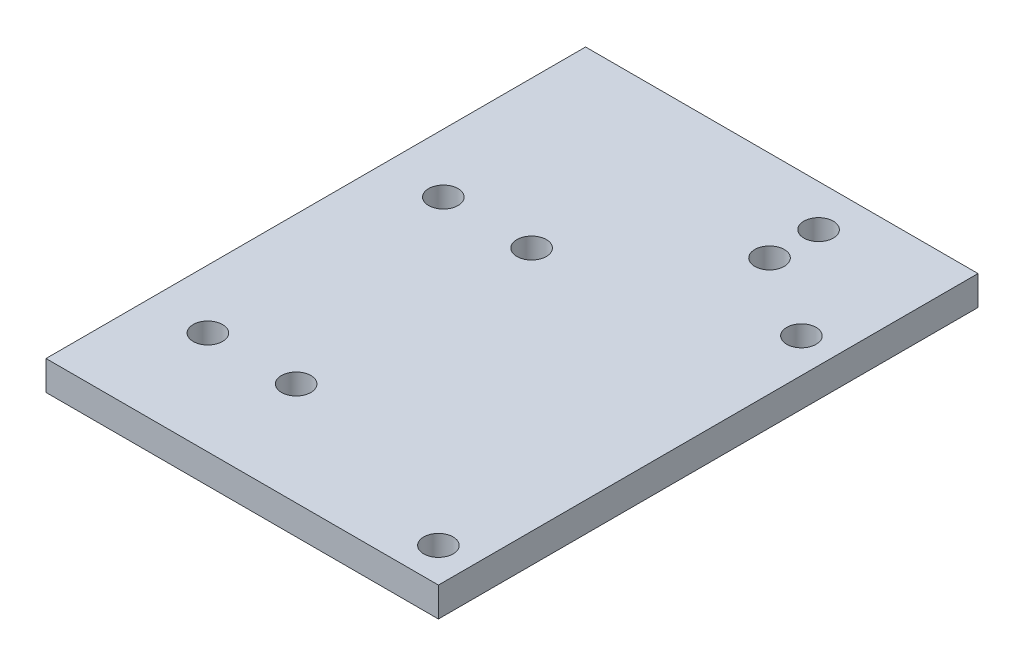
ISO-10303-21;
HEADER;
FILE_DESCRIPTION(('STEP AP214'),'2;1');
FILE_NAME('part.step','',(''),(''),'','','');
FILE_SCHEMA(('AUTOMOTIVE_DESIGN { 1 0 10303 214 1 1 1 1 }'));
ENDSEC;
DATA;
#1=APPLICATION_CONTEXT('core data for automotive mechanical design processes');
#2=APPLICATION_PROTOCOL_DEFINITION('international standard','automotive_design',2000,#1);
#3=PRODUCT_CONTEXT('',#1,'mechanical');
#4=PRODUCT('Part','Part','',(#3));
#5=PRODUCT_RELATED_PRODUCT_CATEGORY('part','',(#4));
#6=PRODUCT_DEFINITION_FORMATION('','',#4);
#7=PRODUCT_DEFINITION_CONTEXT('part definition',#1,'design');
#8=PRODUCT_DEFINITION('design','',#6,#7);
#9=PRODUCT_DEFINITION_SHAPE('','',#8);
#10=(LENGTH_UNIT() NAMED_UNIT(*) SI_UNIT(.MILLI.,.METRE.));
#11=(NAMED_UNIT(*) PLANE_ANGLE_UNIT() SI_UNIT($,.RADIAN.));
#12=(NAMED_UNIT(*) SI_UNIT($,.STERADIAN.) SOLID_ANGLE_UNIT());
#13=UNCERTAINTY_MEASURE_WITH_UNIT(LENGTH_MEASURE(1.E-05),#10,'distance_accuracy_value','');
#14=(GEOMETRIC_REPRESENTATION_CONTEXT(3) GLOBAL_UNCERTAINTY_ASSIGNED_CONTEXT((#13)) GLOBAL_UNIT_ASSIGNED_CONTEXT((#10,
#11,#12)) REPRESENTATION_CONTEXT('',''));
#15=CARTESIAN_POINT('',(0.,0.,0.));
#16=DIRECTION('',(0.,0.,1.));
#17=DIRECTION('',(1.,0.,0.));
#18=AXIS2_PLACEMENT_3D('',#15,#16,#17);
#19=CARTESIAN_POINT('',(1.85754189944134,3.,-30.2374301675978));
#20=DIRECTION('',(1.,0.,0.));
#21=DIRECTION('',(0.,0.,-1.));
#22=AXIS2_PLACEMENT_3D('',#19,#20,#21);
#23=PLANE('',#22);
#24=DIRECTION('',(0.,0.,1.));
#25=VECTOR('',#24,1.);
#26=CARTESIAN_POINT('',(1.85754189944134,0.,-30.2374301675978));
#27=LINE('',#26,#25);
#28=CARTESIAN_POINT('',(1.85754189944134,0.,-30.2374301675978));
#29=VERTEX_POINT('',#28);
#30=CARTESIAN_POINT('',(1.85754189944135,0.,24.7625698324022));
#31=VERTEX_POINT('',#30);
#32=EDGE_CURVE('E98',#29,#31,#27,.T.);
#33=ORIENTED_EDGE('',*,*,#32,.T.);
#34=DIRECTION('',(0.,-1.,0.));
#35=VECTOR('',#34,1.);
#36=CARTESIAN_POINT('',(1.85754189944135,3.,24.7625698324022));
#37=LINE('',#36,#35);
#38=CARTESIAN_POINT('',(1.85754189944135,3.,24.7625698324022));
#39=VERTEX_POINT('',#38);
#40=EDGE_CURVE('E11',#39,#31,#37,.T.);
#41=ORIENTED_EDGE('',*,*,#40,.F.);
#42=DIRECTION('',(0.,0.,1.));
#43=VECTOR('',#42,1.);
#44=CARTESIAN_POINT('',(1.85754189944134,3.,-30.2374301675978));
#45=LINE('',#44,#43);
#46=CARTESIAN_POINT('',(1.85754189944134,3.,-30.2374301675978));
#47=VERTEX_POINT('',#46);
#48=EDGE_CURVE('E86',#47,#39,#45,.T.);
#49=ORIENTED_EDGE('',*,*,#48,.F.);
#50=DIRECTION('',(0.,-1.,0.));
#51=VECTOR('',#50,1.);
#52=CARTESIAN_POINT('',(1.85754189944134,3.,-30.2374301675978));
#53=LINE('',#52,#51);
#54=EDGE_CURVE('E94',#47,#29,#53,.T.);
#55=ORIENTED_EDGE('',*,*,#54,.T.);
#56=EDGE_LOOP('',(#33,#41,#49,#55));
#57=FACE_BOUND('',#56,.T.);
#58=ADVANCED_FACE('F35',(#57),#23,.F.);
#59=CARTESIAN_POINT('',(1.85754189944135,3.,24.7625698324022));
#60=DIRECTION('',(0.,0.,-1.));
#61=DIRECTION('',(-1.,0.,0.));
#62=AXIS2_PLACEMENT_3D('',#59,#60,#61);
#63=PLANE('',#62);
#64=DIRECTION('',(1.,0.,0.));
#65=VECTOR('',#64,1.);
#66=CARTESIAN_POINT('',(1.85754189944135,0.,24.7625698324022));
#67=LINE('',#66,#65);
#68=CARTESIAN_POINT('',(41.8575418994413,0.,24.7625698324022));
#69=VERTEX_POINT('',#68);
#70=EDGE_CURVE('E90',#31,#69,#67,.T.);
#71=ORIENTED_EDGE('',*,*,#70,.T.);
#72=DIRECTION('',(0.,-1.,0.));
#73=VECTOR('',#72,1.);
#74=CARTESIAN_POINT('',(41.8575418994413,3.,24.7625698324022));
#75=LINE('',#74,#73);
#76=CARTESIAN_POINT('',(41.8575418994413,3.,24.7625698324022));
#77=VERTEX_POINT('',#76);
#78=EDGE_CURVE('E43',#77,#69,#75,.T.);
#79=ORIENTED_EDGE('',*,*,#78,.F.);
#80=DIRECTION('',(1.,0.,0.));
#81=VECTOR('',#80,1.);
#82=CARTESIAN_POINT('',(1.85754189944135,3.,24.7625698324022));
#83=LINE('',#82,#81);
#84=EDGE_CURVE('E81',#39,#77,#83,.T.);
#85=ORIENTED_EDGE('',*,*,#84,.F.);
#86=ORIENTED_EDGE('',*,*,#40,.T.);
#87=EDGE_LOOP('',(#71,#79,#85,#86));
#88=FACE_BOUND('',#87,.T.);
#89=ADVANCED_FACE('F89',(#88),#63,.F.);
#90=CARTESIAN_POINT('',(41.8575418994413,3.,-30.2374301675978));
#91=DIRECTION('',(-1.,0.,0.));
#92=DIRECTION('',(0.,0.,1.));
#93=AXIS2_PLACEMENT_3D('',#90,#91,#92);
#94=PLANE('',#93);
#95=DIRECTION('',(0.,0.,-1.));
#96=VECTOR('',#95,1.);
#97=CARTESIAN_POINT('',(41.8575418994413,0.,-30.2374301675978));
#98=LINE('',#97,#96);
#99=CARTESIAN_POINT('',(41.8575418994413,0.,-30.2374301675978));
#100=VERTEX_POINT('',#99);
#101=EDGE_CURVE('E68',#69,#100,#98,.T.);
#102=ORIENTED_EDGE('',*,*,#101,.T.);
#103=DIRECTION('',(0.,-1.,0.));
#104=VECTOR('',#103,1.);
#105=CARTESIAN_POINT('',(41.8575418994413,3.,-30.2374301675978));
#106=LINE('',#105,#104);
#107=CARTESIAN_POINT('',(41.8575418994413,3.,-30.2374301675978));
#108=VERTEX_POINT('',#107);
#109=EDGE_CURVE('E91',#108,#100,#106,.T.);
#110=ORIENTED_EDGE('',*,*,#109,.F.);
#111=DIRECTION('',(0.,0.,-1.));
#112=VECTOR('',#111,1.);
#113=CARTESIAN_POINT('',(41.8575418994413,3.,-30.2374301675978));
#114=LINE('',#113,#112);
#115=EDGE_CURVE('E84',#77,#108,#114,.T.);
#116=ORIENTED_EDGE('',*,*,#115,.F.);
#117=ORIENTED_EDGE('',*,*,#78,.T.);
#118=EDGE_LOOP('',(#102,#110,#116,#117));
#119=FACE_BOUND('',#118,.T.);
#120=ADVANCED_FACE('F92',(#119),#94,.F.);
#121=CARTESIAN_POINT('',(1.85754189944134,3.,-30.2374301675978));
#122=DIRECTION('',(0.,0.,1.));
#123=DIRECTION('',(1.,0.,0.));
#124=AXIS2_PLACEMENT_3D('',#121,#122,#123);
#125=PLANE('',#124);
#126=DIRECTION('',(-1.,0.,0.));
#127=VECTOR('',#126,1.);
#128=CARTESIAN_POINT('',(1.85754189944134,0.,-30.2374301675978));
#129=LINE('',#128,#127);
#130=EDGE_CURVE('E74',#100,#29,#129,.T.);
#131=ORIENTED_EDGE('',*,*,#130,.T.);
#132=ORIENTED_EDGE('',*,*,#54,.F.);
#133=DIRECTION('',(-1.,0.,0.));
#134=VECTOR('',#133,1.);
#135=CARTESIAN_POINT('',(1.85754189944134,3.,-30.2374301675978));
#136=LINE('',#135,#134);
#137=EDGE_CURVE('E51',#108,#47,#136,.T.);
#138=ORIENTED_EDGE('',*,*,#137,.F.);
#139=ORIENTED_EDGE('',*,*,#109,.T.);
#140=EDGE_LOOP('',(#131,#132,#138,#139));
#141=FACE_BOUND('',#140,.T.);
#142=ADVANCED_FACE('F106',(#141),#125,.F.);
#143=CARTESIAN_POINT('',(0.,3.,0.));
#144=DIRECTION('',(0.,1.,0.));
#145=DIRECTION('',(0.,0.,1.));
#146=AXIS2_PLACEMENT_3D('',#143,#144,#145);
#147=PLANE('',#146);
#148=CARTESIAN_POINT('',(38.3575418994413,3.,21.2625698324022));
#149=DIRECTION('',(0.,1.,0.));
#150=DIRECTION('',(0.,0.,1.));
#151=AXIS2_PLACEMENT_3D('',#148,#149,#150);
#152=CIRCLE('',#151,1.5);
#153=CARTESIAN_POINT('',(38.3575418994413,3.,22.7625698324022));
#154=VERTEX_POINT('',#153);
#155=EDGE_CURVE('E137',#154,#154,#152,.T.);
#156=ORIENTED_EDGE('',*,*,#155,.F.);
#157=EDGE_LOOP('',(#156));
#158=FACE_BOUND('',#157,.T.);
#159=CARTESIAN_POINT('',(29.8575418994413,3.,-25.9874301675978));
#160=DIRECTION('',(0.,1.,0.));
#161=DIRECTION('',(0.,0.,1.));
#162=AXIS2_PLACEMENT_3D('',#159,#160,#161);
#163=CIRCLE('',#162,1.5);
#164=CARTESIAN_POINT('',(29.8575418994413,3.,-24.4874301675978));
#165=VERTEX_POINT('',#164);
#166=EDGE_CURVE('E138',#165,#165,#163,.T.);
#167=ORIENTED_EDGE('',*,*,#166,.F.);
#168=EDGE_LOOP('',(#167));
#169=FACE_BOUND('',#168,.T.);
#170=CARTESIAN_POINT('',(29.8575418994413,3.,-20.9874301675978));
#171=DIRECTION('',(0.,1.,0.));
#172=DIRECTION('',(0.,0.,1.));
#173=AXIS2_PLACEMENT_3D('',#170,#171,#172);
#174=CIRCLE('',#173,1.5);
#175=CARTESIAN_POINT('',(29.8575418994413,3.,-19.4874301675978));
#176=VERTEX_POINT('',#175);
#177=EDGE_CURVE('E144',#176,#176,#174,.T.);
#178=ORIENTED_EDGE('',*,*,#177,.F.);
#179=EDGE_LOOP('',(#178));
#180=FACE_BOUND('',#179,.T.);
#181=CARTESIAN_POINT('',(16.8575418994413,3.,-9.73743016759776));
#182=DIRECTION('',(0.,1.,0.));
#183=DIRECTION('',(0.,0.,1.));
#184=AXIS2_PLACEMENT_3D('',#181,#182,#183);
#185=CIRCLE('',#184,1.5);
#186=CARTESIAN_POINT('',(16.8575418994413,3.,-8.23743016759776));
#187=VERTEX_POINT('',#186);
#188=EDGE_CURVE('E150',#187,#187,#185,.T.);
#189=ORIENTED_EDGE('',*,*,#188,.F.);
#190=EDGE_LOOP('',(#189));
#191=FACE_BOUND('',#190,.T.);
#192=CARTESIAN_POINT('',(7.85754189944134,3.,-9.73743016759776));
#193=DIRECTION('',(0.,1.,0.));
#194=DIRECTION('',(0.,0.,1.));
#195=AXIS2_PLACEMENT_3D('',#192,#193,#194);
#196=CIRCLE('',#195,1.5);
#197=CARTESIAN_POINT('',(7.85754189944134,3.,-8.23743016759776));
#198=VERTEX_POINT('',#197);
#199=EDGE_CURVE('E112',#198,#198,#196,.T.);
#200=ORIENTED_EDGE('',*,*,#199,.F.);
#201=EDGE_LOOP('',(#200));
#202=FACE_BOUND('',#201,.T.);
#203=CARTESIAN_POINT('',(7.85754189944134,3.,14.2625698324022));
#204=DIRECTION('',(0.,1.,0.));
#205=DIRECTION('',(0.,0.,1.));
#206=AXIS2_PLACEMENT_3D('',#203,#204,#205);
#207=CIRCLE('',#206,1.5);
#208=CARTESIAN_POINT('',(7.85754189944134,3.,15.7625698324022));
#209=VERTEX_POINT('',#208);
#210=EDGE_CURVE('E119',#209,#209,#207,.T.);
#211=ORIENTED_EDGE('',*,*,#210,.F.);
#212=EDGE_LOOP('',(#211));
#213=FACE_BOUND('',#212,.T.);
#214=CARTESIAN_POINT('',(16.8575418994413,3.,14.2625698324022));
#215=DIRECTION('',(0.,1.,0.));
#216=DIRECTION('',(0.,0.,1.));
#217=AXIS2_PLACEMENT_3D('',#214,#215,#216);
#218=CIRCLE('',#217,1.5);
#219=CARTESIAN_POINT('',(16.8575418994413,3.,15.7625698324022));
#220=VERTEX_POINT('',#219);
#221=EDGE_CURVE('E125',#220,#220,#218,.T.);
#222=ORIENTED_EDGE('',*,*,#221,.F.);
#223=EDGE_LOOP('',(#222));
#224=FACE_BOUND('',#223,.T.);
#225=CARTESIAN_POINT('',(38.3575418994413,3.,-15.7374301675978));
#226=DIRECTION('',(0.,1.,0.));
#227=DIRECTION('',(0.,0.,1.));
#228=AXIS2_PLACEMENT_3D('',#225,#226,#227);
#229=CIRCLE('',#228,1.5);
#230=CARTESIAN_POINT('',(38.3575418994413,3.,-14.2374301675978));
#231=VERTEX_POINT('',#230);
#232=EDGE_CURVE('E131',#231,#231,#229,.T.);
#233=ORIENTED_EDGE('',*,*,#232,.F.);
#234=EDGE_LOOP('',(#233));
#235=FACE_BOUND('',#234,.T.);
#236=ORIENTED_EDGE('',*,*,#48,.T.);
#237=ORIENTED_EDGE('',*,*,#84,.T.);
#238=ORIENTED_EDGE('',*,*,#115,.T.);
#239=ORIENTED_EDGE('',*,*,#137,.T.);
#240=EDGE_LOOP('',(#236,#237,#238,#239));
#241=FACE_BOUND('',#240,.T.);
#242=ADVANCED_FACE('F82',(#158,#169,#180,#191,#202,#213,#224,#235,#241),#147,.T.);
#243=CARTESIAN_POINT('',(0.,0.,0.));
#244=DIRECTION('',(0.,1.,0.));
#245=DIRECTION('',(0.,0.,1.));
#246=AXIS2_PLACEMENT_3D('',#243,#244,#245);
#247=PLANE('',#246);
#248=CARTESIAN_POINT('',(38.3575418994413,0.,21.2625698324022));
#249=DIRECTION('',(0.,1.,0.));
#250=DIRECTION('',(0.,0.,1.));
#251=AXIS2_PLACEMENT_3D('',#248,#249,#250);
#252=CIRCLE('',#251,1.5);
#253=CARTESIAN_POINT('',(38.3575418994413,0.,22.7625698324022));
#254=VERTEX_POINT('',#253);
#255=EDGE_CURVE('E101',#254,#254,#252,.T.);
#256=ORIENTED_EDGE('',*,*,#255,.T.);
#257=EDGE_LOOP('',(#256));
#258=FACE_BOUND('',#257,.T.);
#259=CARTESIAN_POINT('',(29.8575418994413,0.,-25.9874301675978));
#260=DIRECTION('',(0.,1.,0.));
#261=DIRECTION('',(0.,0.,1.));
#262=AXIS2_PLACEMENT_3D('',#259,#260,#261);
#263=CIRCLE('',#262,1.5);
#264=CARTESIAN_POINT('',(29.8575418994413,0.,-24.4874301675978));
#265=VERTEX_POINT('',#264);
#266=EDGE_CURVE('E141',#265,#265,#263,.T.);
#267=ORIENTED_EDGE('',*,*,#266,.T.);
#268=EDGE_LOOP('',(#267));
#269=FACE_BOUND('',#268,.T.);
#270=CARTESIAN_POINT('',(29.8575418994413,0.,-20.9874301675978));
#271=DIRECTION('',(0.,1.,0.));
#272=DIRECTION('',(0.,0.,1.));
#273=AXIS2_PLACEMENT_3D('',#270,#271,#272);
#274=CIRCLE('',#273,1.5);
#275=CARTESIAN_POINT('',(29.8575418994413,0.,-19.4874301675978));
#276=VERTEX_POINT('',#275);
#277=EDGE_CURVE('E147',#276,#276,#274,.T.);
#278=ORIENTED_EDGE('',*,*,#277,.T.);
#279=EDGE_LOOP('',(#278));
#280=FACE_BOUND('',#279,.T.);
#281=CARTESIAN_POINT('',(16.8575418994413,0.,-9.73743016759776));
#282=DIRECTION('',(0.,1.,0.));
#283=DIRECTION('',(0.,0.,1.));
#284=AXIS2_PLACEMENT_3D('',#281,#282,#283);
#285=CIRCLE('',#284,1.5);
#286=CARTESIAN_POINT('',(16.8575418994413,0.,-8.23743016759776));
#287=VERTEX_POINT('',#286);
#288=EDGE_CURVE('E116',#287,#287,#285,.T.);
#289=ORIENTED_EDGE('',*,*,#288,.T.);
#290=EDGE_LOOP('',(#289));
#291=FACE_BOUND('',#290,.T.);
#292=CARTESIAN_POINT('',(7.85754189944134,0.,-9.73743016759776));
#293=DIRECTION('',(0.,1.,0.));
#294=DIRECTION('',(0.,0.,1.));
#295=AXIS2_PLACEMENT_3D('',#292,#293,#294);
#296=CIRCLE('',#295,1.5);
#297=CARTESIAN_POINT('',(7.85754189944134,0.,-8.23743016759776));
#298=VERTEX_POINT('',#297);
#299=EDGE_CURVE('E115',#298,#298,#296,.T.);
#300=ORIENTED_EDGE('',*,*,#299,.T.);
#301=EDGE_LOOP('',(#300));
#302=FACE_BOUND('',#301,.T.);
#303=CARTESIAN_POINT('',(7.85754189944134,0.,14.2625698324022));
#304=DIRECTION('',(0.,1.,0.));
#305=DIRECTION('',(0.,0.,1.));
#306=AXIS2_PLACEMENT_3D('',#303,#304,#305);
#307=CIRCLE('',#306,1.5);
#308=CARTESIAN_POINT('',(7.85754189944134,0.,15.7625698324022));
#309=VERTEX_POINT('',#308);
#310=EDGE_CURVE('E122',#309,#309,#307,.T.);
#311=ORIENTED_EDGE('',*,*,#310,.T.);
#312=EDGE_LOOP('',(#311));
#313=FACE_BOUND('',#312,.T.);
#314=CARTESIAN_POINT('',(16.8575418994413,0.,14.2625698324022));
#315=DIRECTION('',(0.,1.,0.));
#316=DIRECTION('',(0.,0.,1.));
#317=AXIS2_PLACEMENT_3D('',#314,#315,#316);
#318=CIRCLE('',#317,1.5);
#319=CARTESIAN_POINT('',(16.8575418994413,0.,15.7625698324022));
#320=VERTEX_POINT('',#319);
#321=EDGE_CURVE('E128',#320,#320,#318,.T.);
#322=ORIENTED_EDGE('',*,*,#321,.T.);
#323=EDGE_LOOP('',(#322));
#324=FACE_BOUND('',#323,.T.);
#325=CARTESIAN_POINT('',(38.3575418994413,0.,-15.7374301675978));
#326=DIRECTION('',(0.,1.,0.));
#327=DIRECTION('',(0.,0.,1.));
#328=AXIS2_PLACEMENT_3D('',#325,#326,#327);
#329=CIRCLE('',#328,1.5);
#330=CARTESIAN_POINT('',(38.3575418994413,0.,-14.2374301675978));
#331=VERTEX_POINT('',#330);
#332=EDGE_CURVE('E134',#331,#331,#329,.T.);
#333=ORIENTED_EDGE('',*,*,#332,.T.);
#334=EDGE_LOOP('',(#333));
#335=FACE_BOUND('',#334,.T.);
#336=ORIENTED_EDGE('',*,*,#32,.F.);
#337=ORIENTED_EDGE('',*,*,#130,.F.);
#338=ORIENTED_EDGE('',*,*,#101,.F.);
#339=ORIENTED_EDGE('',*,*,#70,.F.);
#340=EDGE_LOOP('',(#336,#337,#338,#339));
#341=FACE_BOUND('',#340,.T.);
#342=ADVANCED_FACE('F109',(#258,#269,#280,#291,#302,#313,#324,#335,#341),#247,.F.);
#343=CARTESIAN_POINT('',(38.3575418994413,0.,-15.7374301675978));
#344=DIRECTION('',(0.,1.,0.));
#345=DIRECTION('',(0.,0.,1.));
#346=AXIS2_PLACEMENT_3D('',#343,#344,#345);
#347=CYLINDRICAL_SURFACE('',#346,1.5);
#348=ORIENTED_EDGE('',*,*,#332,.F.);
#349=EDGE_LOOP('',(#348));
#350=FACE_BOUND('',#349,.T.);
#351=ORIENTED_EDGE('',*,*,#232,.T.);
#352=EDGE_LOOP('',(#351));
#353=FACE_BOUND('',#352,.T.);
#354=ADVANCED_FACE('F186',(#350,#353),#347,.F.);
#355=CARTESIAN_POINT('',(16.8575418994413,0.,14.2625698324022));
#356=DIRECTION('',(0.,1.,0.));
#357=DIRECTION('',(0.,0.,1.));
#358=AXIS2_PLACEMENT_3D('',#355,#356,#357);
#359=CYLINDRICAL_SURFACE('',#358,1.5);
#360=ORIENTED_EDGE('',*,*,#321,.F.);
#361=EDGE_LOOP('',(#360));
#362=FACE_BOUND('',#361,.T.);
#363=ORIENTED_EDGE('',*,*,#221,.T.);
#364=EDGE_LOOP('',(#363));
#365=FACE_BOUND('',#364,.T.);
#366=ADVANCED_FACE('F188',(#362,#365),#359,.F.);
#367=CARTESIAN_POINT('',(7.85754189944134,0.,14.2625698324022));
#368=DIRECTION('',(0.,1.,0.));
#369=DIRECTION('',(0.,0.,1.));
#370=AXIS2_PLACEMENT_3D('',#367,#368,#369);
#371=CYLINDRICAL_SURFACE('',#370,1.5);
#372=ORIENTED_EDGE('',*,*,#310,.F.);
#373=EDGE_LOOP('',(#372));
#374=FACE_BOUND('',#373,.T.);
#375=ORIENTED_EDGE('',*,*,#210,.T.);
#376=EDGE_LOOP('',(#375));
#377=FACE_BOUND('',#376,.T.);
#378=ADVANCED_FACE('F195',(#374,#377),#371,.F.);
#379=CARTESIAN_POINT('',(7.85754189944134,0.,-9.73743016759776));
#380=DIRECTION('',(0.,1.,0.));
#381=DIRECTION('',(0.,0.,1.));
#382=AXIS2_PLACEMENT_3D('',#379,#380,#381);
#383=CYLINDRICAL_SURFACE('',#382,1.5);
#384=ORIENTED_EDGE('',*,*,#299,.F.);
#385=EDGE_LOOP('',(#384));
#386=FACE_BOUND('',#385,.T.);
#387=ORIENTED_EDGE('',*,*,#199,.T.);
#388=EDGE_LOOP('',(#387));
#389=FACE_BOUND('',#388,.T.);
#390=ADVANCED_FACE('F212',(#386,#389),#383,.F.);
#391=CARTESIAN_POINT('',(16.8575418994413,0.,-9.73743016759776));
#392=DIRECTION('',(0.,1.,0.));
#393=DIRECTION('',(0.,0.,1.));
#394=AXIS2_PLACEMENT_3D('',#391,#392,#393);
#395=CYLINDRICAL_SURFACE('',#394,1.5);
#396=ORIENTED_EDGE('',*,*,#288,.F.);
#397=EDGE_LOOP('',(#396));
#398=FACE_BOUND('',#397,.T.);
#399=ORIENTED_EDGE('',*,*,#188,.T.);
#400=EDGE_LOOP('',(#399));
#401=FACE_BOUND('',#400,.T.);
#402=ADVANCED_FACE('F215',(#398,#401),#395,.F.);
#403=CARTESIAN_POINT('',(29.8575418994413,0.,-20.9874301675978));
#404=DIRECTION('',(0.,1.,0.));
#405=DIRECTION('',(0.,0.,1.));
#406=AXIS2_PLACEMENT_3D('',#403,#404,#405);
#407=CYLINDRICAL_SURFACE('',#406,1.5);
#408=ORIENTED_EDGE('',*,*,#277,.F.);
#409=EDGE_LOOP('',(#408));
#410=FACE_BOUND('',#409,.T.);
#411=ORIENTED_EDGE('',*,*,#177,.T.);
#412=EDGE_LOOP('',(#411));
#413=FACE_BOUND('',#412,.T.);
#414=ADVANCED_FACE('F240',(#410,#413),#407,.F.);
#415=CARTESIAN_POINT('',(29.8575418994413,0.,-25.9874301675978));
#416=DIRECTION('',(0.,1.,0.));
#417=DIRECTION('',(0.,0.,1.));
#418=AXIS2_PLACEMENT_3D('',#415,#416,#417);
#419=CYLINDRICAL_SURFACE('',#418,1.5);
#420=ORIENTED_EDGE('',*,*,#266,.F.);
#421=EDGE_LOOP('',(#420));
#422=FACE_BOUND('',#421,.T.);
#423=ORIENTED_EDGE('',*,*,#166,.T.);
#424=EDGE_LOOP('',(#423));
#425=FACE_BOUND('',#424,.T.);
#426=ADVANCED_FACE('F165',(#422,#425),#419,.F.);
#427=CARTESIAN_POINT('',(38.3575418994413,0.,21.2625698324022));
#428=DIRECTION('',(0.,1.,0.));
#429=DIRECTION('',(0.,0.,1.));
#430=AXIS2_PLACEMENT_3D('',#427,#428,#429);
#431=CYLINDRICAL_SURFACE('',#430,1.5);
#432=ORIENTED_EDGE('',*,*,#255,.F.);
#433=EDGE_LOOP('',(#432));
#434=FACE_BOUND('',#433,.T.);
#435=ORIENTED_EDGE('',*,*,#155,.T.);
#436=EDGE_LOOP('',(#435));
#437=FACE_BOUND('',#436,.T.);
#438=ADVANCED_FACE('F162',(#434,#437),#431,.F.);
#439=CLOSED_SHELL('',(#58,#89,#120,#142,#242,#342,#354,#366,#378,#390,#402,#414,#426,#438));
#440=MANIFOLD_SOLID_BREP('B2',#439);
#441=ADVANCED_BREP_SHAPE_REPRESENTATION('',(#18,#440),#14);
#442=SHAPE_DEFINITION_REPRESENTATION(#9,#441);
ENDSEC;
END-ISO-10303-21;
